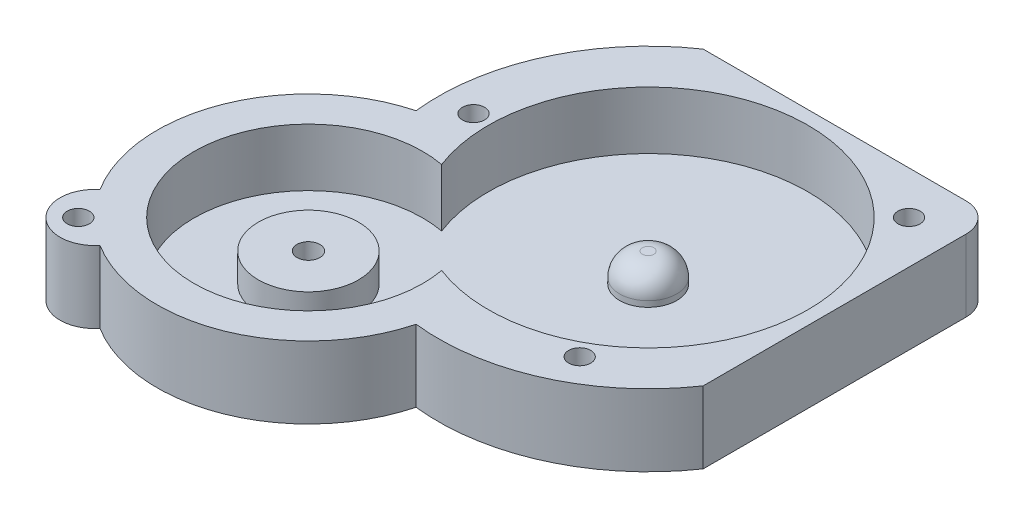
ISO-10303-21;
HEADER;
FILE_DESCRIPTION(('STEP AP214'),'2;1');
FILE_NAME('part.step','',(''),(''),'','','');
FILE_SCHEMA(('AUTOMOTIVE_DESIGN { 1 0 10303 214 1 1 1 1 }'));
ENDSEC;
DATA;
#1=APPLICATION_CONTEXT('core data for automotive mechanical design processes');
#2=APPLICATION_PROTOCOL_DEFINITION('international standard','automotive_design',2000,#1);
#3=PRODUCT_CONTEXT('',#1,'mechanical');
#4=PRODUCT('Part','Part','',(#3));
#5=PRODUCT_RELATED_PRODUCT_CATEGORY('part','',(#4));
#6=PRODUCT_DEFINITION_FORMATION('','',#4);
#7=PRODUCT_DEFINITION_CONTEXT('part definition',#1,'design');
#8=PRODUCT_DEFINITION('design','',#6,#7);
#9=PRODUCT_DEFINITION_SHAPE('','',#8);
#10=(LENGTH_UNIT() NAMED_UNIT(*) SI_UNIT(.MILLI.,.METRE.));
#11=(NAMED_UNIT(*) PLANE_ANGLE_UNIT() SI_UNIT($,.RADIAN.));
#12=(NAMED_UNIT(*) SI_UNIT($,.STERADIAN.) SOLID_ANGLE_UNIT());
#13=UNCERTAINTY_MEASURE_WITH_UNIT(LENGTH_MEASURE(1.E-05),#10,'distance_accuracy_value','');
#14=(GEOMETRIC_REPRESENTATION_CONTEXT(3) GLOBAL_UNCERTAINTY_ASSIGNED_CONTEXT((#13)) GLOBAL_UNIT_ASSIGNED_CONTEXT((#10,
#11,#12)) REPRESENTATION_CONTEXT('',''));
#15=CARTESIAN_POINT('',(0.,0.,0.));
#16=DIRECTION('',(0.,0.,1.));
#17=DIRECTION('',(1.,0.,0.));
#18=AXIS2_PLACEMENT_3D('',#15,#16,#17);
#19=CARTESIAN_POINT('',(-38.4829242915095,0.635000000000004,-28.9438382197023));
#20=DIRECTION('',(0.,-1.,0.));
#21=DIRECTION('',(0.,0.,-1.));
#22=AXIS2_PLACEMENT_3D('',#19,#20,#21);
#23=PLANE('',#22);
#24=CARTESIAN_POINT('',(-101.750340264647,0.635,34.3235777534356));
#25=DIRECTION('',(0.,-1.,0.));
#26=DIRECTION('',(0.,0.,-1.));
#27=AXIS2_PLACEMENT_3D('',#24,#25,#26);
#28=CIRCLE('',#27,2.45745);
#29=CARTESIAN_POINT('',(-101.750340264647,0.635,31.8661277534356));
#30=VERTEX_POINT('',#29);
#31=EDGE_CURVE('E363',#30,#30,#28,.T.);
#32=ORIENTED_EDGE('',*,*,#31,.F.);
#33=EDGE_LOOP('',(#32));
#34=FACE_BOUND('',#33,.T.);
#35=CARTESIAN_POINT('',(-19.302860594839,0.634999999999999,5.43816370851094));
#36=DIRECTION('',(0.,-1.,0.));
#37=DIRECTION('',(0.,0.,-1.));
#38=AXIS2_PLACEMENT_3D('',#35,#36,#37);
#39=CIRCLE('',#38,2.45744999999999);
#40=CARTESIAN_POINT('',(-19.302860594839,0.635,2.98071370851095));
#41=VERTEX_POINT('',#40);
#42=EDGE_CURVE('E168',#41,#41,#39,.T.);
#43=ORIENTED_EDGE('',*,*,#42,.F.);
#44=EDGE_LOOP('',(#43));
#45=FACE_BOUND('',#44,.T.);
#46=CARTESIAN_POINT('',(-38.4829242915095,0.635000000000004,-28.9438382197023));
#47=DIRECTION('',(0.,-1.,0.));
#48=DIRECTION('',(0.,0.,-1.));
#49=AXIS2_PLACEMENT_3D('',#46,#47,#48);
#50=CIRCLE('',#49,46.5899500000001);
#51=CARTESIAN_POINT('',(0.,0.634999999999999,-2.68192703684189));
#52=VERTEX_POINT('',#51);
#53=CARTESIAN_POINT('',(-43.7198958127497,0.635000000000011,17.3508436594101));
#54=VERTEX_POINT('',#53);
#55=EDGE_CURVE('E191',#52,#54,#50,.T.);
#56=ORIENTED_EDGE('',*,*,#55,.T.);
#57=CARTESIAN_POINT('',(-76.2,0.635000000000011,8.77323748878821));
#58=DIRECTION('',(0.,-1.,0.));
#59=DIRECTION('',(0.,0.,-1.));
#60=AXIS2_PLACEMENT_3D('',#57,#58,#59);
#61=CIRCLE('',#60,33.5936377255117);
#62=CARTESIAN_POINT('',(-93.9898070736464,0.635000000000008,37.2698207912715));
#63=VERTEX_POINT('',#62);
#64=EDGE_CURVE('E128',#63,#54,#61,.F.);
#65=ORIENTED_EDGE('',*,*,#64,.F.);
#66=CARTESIAN_POINT('',(-99.9542890404336,0.635,32.5275265292218));
#67=DIRECTION('',(0.,-1.,0.));
#68=DIRECTION('',(0.,0.,-1.));
#69=AXIS2_PLACEMENT_3D('',#66,#67,#68);
#70=CIRCLE('',#69,7.62);
#71=CARTESIAN_POINT('',(-104.696583302483,0.635000000000001,26.5630445624345));
#72=VERTEX_POINT('',#71);
#73=EDGE_CURVE('E132',#72,#63,#70,.F.);
#74=ORIENTED_EDGE('',*,*,#73,.F.);
#75=CARTESIAN_POINT('',(-84.777606170622,0.635000000000006,-23.7068666984621));
#76=VERTEX_POINT('',#75);
#77=EDGE_CURVE('E119',#76,#72,#61,.F.);
#78=ORIENTED_EDGE('',*,*,#77,.F.);
#79=CARTESIAN_POINT('',(-38.4829242915095,0.635000000000004,-28.9438382197023));
#80=DIRECTION('',(0.,-1.,0.));
#81=DIRECTION('',(0.,0.,-1.));
#82=AXIS2_PLACEMENT_3D('',#79,#80,#81);
#83=CIRCLE('',#82,46.58995);
#84=CARTESIAN_POINT('',(-64.74483547437,0.63500000000001,-67.4267625112118));
#85=VERTEX_POINT('',#84);
#86=EDGE_CURVE('E176',#76,#85,#83,.T.);
#87=ORIENTED_EDGE('',*,*,#86,.T.);
#88=DIRECTION('',(1.,0.,0.));
#89=VECTOR('',#88,1.);
#90=CARTESIAN_POINT('',(-64.74483547437,0.63500000000001,-67.4267625112118));
#91=LINE('',#90,#89);
#92=CARTESIAN_POINT('',(-6.35,0.635000000000007,-67.4267625112118));
#93=VERTEX_POINT('',#92);
#94=EDGE_CURVE('E179',#85,#93,#91,.T.);
#95=ORIENTED_EDGE('',*,*,#94,.T.);
#96=CARTESIAN_POINT('',(-6.35,0.635000000000006,-61.0767625112118));
#97=DIRECTION('',(0.,-1.,0.));
#98=DIRECTION('',(0.,0.,-1.));
#99=AXIS2_PLACEMENT_3D('',#96,#97,#98);
#100=CIRCLE('',#99,6.35);
#101=CARTESIAN_POINT('',(0.,0.635000000000005,-61.0767625112118));
#102=VERTEX_POINT('',#101);
#103=EDGE_CURVE('E183',#93,#102,#100,.T.);
#104=ORIENTED_EDGE('',*,*,#103,.T.);
#105=DIRECTION('',(0.,0.,1.));
#106=VECTOR('',#105,1.);
#107=CARTESIAN_POINT('',(0.,0.635000000000006,-61.0767625112118));
#108=LINE('',#107,#106);
#109=EDGE_CURVE('E187',#102,#52,#108,.T.);
#110=ORIENTED_EDGE('',*,*,#109,.T.);
#111=EDGE_LOOP('',(#56,#65,#74,#78,#87,#95,#104,#110));
#112=FACE_BOUND('',#111,.T.);
#113=CARTESIAN_POINT('',(-77.848643242643,0.635000000000006,-29.5244167762885));
#114=DIRECTION('',(0.,-1.,0.));
#115=DIRECTION('',(0.,0.,-1.));
#116=AXIS2_PLACEMENT_3D('',#113,#114,#115);
#117=CIRCLE('',#116,2.45745);
#118=CARTESIAN_POINT('',(-77.848643242643,0.635000000000007,-31.9818667762885));
#119=VERTEX_POINT('',#118);
#120=EDGE_CURVE('E172',#119,#119,#117,.T.);
#121=ORIENTED_EDGE('',*,*,#120,.F.);
#122=EDGE_LOOP('',(#121));
#123=FACE_BOUND('',#122,.T.);
#124=CARTESIAN_POINT('',(-9.52499999999998,0.634999999999997,-57.9017625112118));
#125=DIRECTION('',(0.,1.,0.));
#126=DIRECTION('',(0.,0.,1.));
#127=AXIS2_PLACEMENT_3D('',#124,#125,#126);
#128=CIRCLE('',#127,2.45745);
#129=CARTESIAN_POINT('',(-9.52499999999998,0.634999999999996,-55.4443125112118));
#130=VERTEX_POINT('',#129);
#131=EDGE_CURVE('E353',#130,#130,#128,.T.);
#132=ORIENTED_EDGE('',*,*,#131,.T.);
#133=EDGE_LOOP('',(#132));
#134=FACE_BOUND('',#133,.T.);
#135=ADVANCED_FACE('F43',(#34,#45,#112,#123,#134),#23,.T.);
#136=CARTESIAN_POINT('',(-76.2,-92.8073819297677,8.7732374887882));
#137=DIRECTION('',(0.,1.,0.));
#138=DIRECTION('',(0.,0.,1.));
#139=AXIS2_PLACEMENT_3D('',#136,#137,#138);
#140=CYLINDRICAL_SURFACE('',#139,33.5936377255117);
#141=DIRECTION('',(0.,1.,0.));
#142=VECTOR('',#141,1.);
#143=CARTESIAN_POINT('',(-93.9898070736463,-18.5763586352433,37.2698207912715));
#144=LINE('',#143,#142);
#145=CARTESIAN_POINT('',(-93.9898070736464,16.604,37.2698207912715));
#146=VERTEX_POINT('',#145);
#147=EDGE_CURVE('E137',#63,#146,#144,.T.);
#148=ORIENTED_EDGE('',*,*,#147,.F.);
#149=ORIENTED_EDGE('',*,*,#64,.T.);
#150=DIRECTION('',(0.,1.,0.));
#151=VECTOR('',#150,1.);
#152=CARTESIAN_POINT('',(-43.7198958127497,-92.8073819297677,17.3508436594101));
#153=LINE('',#152,#151);
#154=CARTESIAN_POINT('',(-43.7198958127497,16.604,17.3508436594101));
#155=VERTEX_POINT('',#154);
#156=EDGE_CURVE('E127',#54,#155,#153,.T.);
#157=ORIENTED_EDGE('',*,*,#156,.T.);
#158=CARTESIAN_POINT('',(-76.2,16.604,8.77323748878821));
#159=DIRECTION('',(0.,1.,0.));
#160=DIRECTION('',(0.,0.,1.));
#161=AXIS2_PLACEMENT_3D('',#158,#159,#160);
#162=CIRCLE('',#161,33.5936377255117);
#163=EDGE_CURVE('E59',#146,#155,#162,.T.);
#164=ORIENTED_EDGE('',*,*,#163,.F.);
#165=EDGE_LOOP('',(#148,#149,#157,#164));
#166=FACE_BOUND('',#165,.T.);
#167=ADVANCED_FACE('F278',(#166),#140,.T.);
#168=CARTESIAN_POINT('',(-6.35,3.81000000000001,-61.0767625112118));
#169=DIRECTION('',(0.,1.,0.));
#170=DIRECTION('',(1.,0.,0.));
#171=AXIS2_PLACEMENT_3D('',#168,#169,#170);
#172=CYLINDRICAL_SURFACE('',#171,6.35);
#173=DIRECTION('',(0.,-1.,0.));
#174=VECTOR('',#173,1.);
#175=CARTESIAN_POINT('',(0.,3.81000000000001,-61.0767625112118));
#176=LINE('',#175,#174);
#177=CARTESIAN_POINT('',(0.,16.604,-61.0767625112118));
#178=VERTEX_POINT('',#177);
#179=EDGE_CURVE('E240',#102,#178,#176,.F.);
#180=ORIENTED_EDGE('',*,*,#179,.F.);
#181=ORIENTED_EDGE('',*,*,#103,.F.);
#182=DIRECTION('',(0.,-1.,0.));
#183=VECTOR('',#182,1.);
#184=CARTESIAN_POINT('',(-6.35,0.,-67.4267625112118));
#185=LINE('',#184,#183);
#186=CARTESIAN_POINT('',(-6.35,16.604,-67.4267625112118));
#187=VERTEX_POINT('',#186);
#188=EDGE_CURVE('E249',#187,#93,#185,.T.);
#189=ORIENTED_EDGE('',*,*,#188,.F.);
#190=CARTESIAN_POINT('',(-6.35,16.604,-61.0767625112118));
#191=DIRECTION('',(0.,1.,0.));
#192=DIRECTION('',(1.,0.,0.));
#193=AXIS2_PLACEMENT_3D('',#190,#191,#192);
#194=CIRCLE('',#193,6.35);
#195=EDGE_CURVE('E201',#178,#187,#194,.T.);
#196=ORIENTED_EDGE('',*,*,#195,.F.);
#197=EDGE_LOOP('',(#180,#181,#189,#196));
#198=FACE_BOUND('',#197,.T.);
#199=ADVANCED_FACE('F288',(#198),#172,.T.);
#200=CARTESIAN_POINT('',(0.,3.81000000000001,-67.4267625112118));
#201=DIRECTION('',(-1.,0.,0.));
#202=DIRECTION('',(0.,1.,0.));
#203=AXIS2_PLACEMENT_3D('',#200,#201,#202);
#204=PLANE('',#203);
#205=DIRECTION('',(0.,-1.,0.));
#206=VECTOR('',#205,1.);
#207=CARTESIAN_POINT('',(0.,16.604,-2.68192703684186));
#208=LINE('',#207,#206);
#209=CARTESIAN_POINT('',(0.,16.604,-2.68192703684186));
#210=VERTEX_POINT('',#209);
#211=EDGE_CURVE('E246',#210,#52,#208,.T.);
#212=ORIENTED_EDGE('',*,*,#211,.T.);
#213=ORIENTED_EDGE('',*,*,#109,.F.);
#214=ORIENTED_EDGE('',*,*,#179,.T.);
#215=DIRECTION('',(0.,0.,-1.));
#216=VECTOR('',#215,1.);
#217=CARTESIAN_POINT('',(0.,16.604,84.9732374887882));
#218=LINE('',#217,#216);
#219=EDGE_CURVE('E197',#210,#178,#218,.T.);
#220=ORIENTED_EDGE('',*,*,#219,.F.);
#221=EDGE_LOOP('',(#212,#213,#214,#220));
#222=FACE_BOUND('',#221,.T.);
#223=ADVANCED_FACE('F323',(#222),#204,.F.);
#224=CARTESIAN_POINT('',(-38.4829242915095,16.604,-28.9438382197023));
#225=DIRECTION('',(0.,-1.,0.));
#226=DIRECTION('',(-1.,0.,0.));
#227=AXIS2_PLACEMENT_3D('',#224,#225,#226);
#228=CYLINDRICAL_SURFACE('',#227,46.58995);
#229=CARTESIAN_POINT('',(-38.4829242915095,16.604,-28.9438382197023));
#230=DIRECTION('',(0.,1.,0.));
#231=DIRECTION('',(1.,0.,0.));
#232=AXIS2_PLACEMENT_3D('',#229,#230,#231);
#233=CIRCLE('',#232,46.58995);
#234=EDGE_CURVE('E194',#155,#210,#233,.T.);
#235=ORIENTED_EDGE('',*,*,#234,.F.);
#236=ORIENTED_EDGE('',*,*,#156,.F.);
#237=ORIENTED_EDGE('',*,*,#55,.F.);
#238=ORIENTED_EDGE('',*,*,#211,.F.);
#239=EDGE_LOOP('',(#235,#236,#237,#238));
#240=FACE_BOUND('',#239,.T.);
#241=ADVANCED_FACE('F320',(#240),#228,.T.);
#242=CARTESIAN_POINT('',(0.,3.81000000000001,-67.4267625112118));
#243=DIRECTION('',(0.,0.,-1.));
#244=DIRECTION('',(-1.,0.,0.));
#245=AXIS2_PLACEMENT_3D('',#242,#243,#244);
#246=PLANE('',#245);
#247=ORIENTED_EDGE('',*,*,#188,.T.);
#248=ORIENTED_EDGE('',*,*,#94,.F.);
#249=DIRECTION('',(0.,-1.,0.));
#250=VECTOR('',#249,1.);
#251=CARTESIAN_POINT('',(-64.74483547437,16.604,-67.4267625112118));
#252=LINE('',#251,#250);
#253=CARTESIAN_POINT('',(-64.74483547437,16.604,-67.4267625112118));
#254=VERTEX_POINT('',#253);
#255=EDGE_CURVE('E228',#254,#85,#252,.T.);
#256=ORIENTED_EDGE('',*,*,#255,.F.);
#257=DIRECTION('',(-1.,0.,0.));
#258=VECTOR('',#257,1.);
#259=CARTESIAN_POINT('',(0.,16.604,-67.4267625112118));
#260=LINE('',#259,#258);
#261=EDGE_CURVE('E205',#187,#254,#260,.T.);
#262=ORIENTED_EDGE('',*,*,#261,.F.);
#263=EDGE_LOOP('',(#247,#248,#256,#262));
#264=FACE_BOUND('',#263,.T.);
#265=ADVANCED_FACE('F306',(#264),#246,.T.);
#266=CARTESIAN_POINT('',(0.,16.604,84.9732374887882));
#267=DIRECTION('',(0.,1.,0.));
#268=DIRECTION('',(1.,0.,0.));
#269=AXIS2_PLACEMENT_3D('',#266,#267,#268);
#270=PLANE('',#269);
#271=CARTESIAN_POINT('',(-101.750340264647,16.604,34.3235777534356));
#272=DIRECTION('',(0.,1.,0.));
#273=DIRECTION('',(0.,0.,1.));
#274=AXIS2_PLACEMENT_3D('',#271,#272,#273);
#275=CIRCLE('',#274,2.45745);
#276=CARTESIAN_POINT('',(-101.750340264647,16.604,36.7810277534356));
#277=VERTEX_POINT('',#276);
#278=EDGE_CURVE('E367',#277,#277,#275,.T.);
#279=ORIENTED_EDGE('',*,*,#278,.F.);
#280=EDGE_LOOP('',(#279));
#281=FACE_BOUND('',#280,.T.);
#282=CARTESIAN_POINT('',(-9.52499999999998,16.604,-57.9017625112118));
#283=DIRECTION('',(0.,1.,0.));
#284=DIRECTION('',(0.,0.,1.));
#285=AXIS2_PLACEMENT_3D('',#282,#283,#284);
#286=CIRCLE('',#285,2.45745);
#287=CARTESIAN_POINT('',(-9.52499999999998,16.604,-55.4443125112118));
#288=VERTEX_POINT('',#287);
#289=EDGE_CURVE('E357',#288,#288,#286,.T.);
#290=ORIENTED_EDGE('',*,*,#289,.F.);
#291=EDGE_LOOP('',(#290));
#292=FACE_BOUND('',#291,.T.);
#293=CARTESIAN_POINT('',(-84.777606170622,16.604,-23.7068666984621));
#294=VERTEX_POINT('',#293);
#295=CARTESIAN_POINT('',(-104.696583302483,16.604,26.5630445624345));
#296=VERTEX_POINT('',#295);
#297=EDGE_CURVE('E147',#294,#296,#162,.T.);
#298=ORIENTED_EDGE('',*,*,#297,.T.);
#299=CARTESIAN_POINT('',(-99.9542890404336,16.604,32.5275265292218));
#300=DIRECTION('',(0.,1.,0.));
#301=DIRECTION('',(0.,0.,1.));
#302=AXIS2_PLACEMENT_3D('',#299,#300,#301);
#303=CIRCLE('',#302,7.62);
#304=EDGE_CURVE('E138',#296,#146,#303,.T.);
#305=ORIENTED_EDGE('',*,*,#304,.T.);
#306=ORIENTED_EDGE('',*,*,#163,.T.);
#307=ORIENTED_EDGE('',*,*,#234,.T.);
#308=ORIENTED_EDGE('',*,*,#219,.T.);
#309=ORIENTED_EDGE('',*,*,#195,.T.);
#310=ORIENTED_EDGE('',*,*,#261,.T.);
#311=CARTESIAN_POINT('',(-38.4829242915095,16.604,-28.9438382197023));
#312=DIRECTION('',(0.,1.,0.));
#313=DIRECTION('',(1.,0.,0.));
#314=AXIS2_PLACEMENT_3D('',#311,#312,#313);
#315=CIRCLE('',#314,46.58995);
#316=EDGE_CURVE('E208',#254,#294,#315,.T.);
#317=ORIENTED_EDGE('',*,*,#316,.T.);
#318=EDGE_LOOP('',(#298,#305,#306,#307,#308,#309,#310,#317));
#319=FACE_BOUND('',#318,.T.);
#320=CARTESIAN_POINT('',(-19.302860594839,16.604,5.43816370851094));
#321=DIRECTION('',(0.,1.,0.));
#322=DIRECTION('',(1.,0.,0.));
#323=AXIS2_PLACEMENT_3D('',#320,#321,#322);
#324=CIRCLE('',#323,2.45744999999999);
#325=CARTESIAN_POINT('',(-16.845410594839,16.604,5.43816370851094));
#326=VERTEX_POINT('',#325);
#327=EDGE_CURVE('E212',#326,#326,#324,.F.);
#328=ORIENTED_EDGE('',*,*,#327,.T.);
#329=EDGE_LOOP('',(#328));
#330=FACE_BOUND('',#329,.T.);
#331=CARTESIAN_POINT('',(-77.848643242643,16.604,-29.5244167762885));
#332=DIRECTION('',(0.,1.,0.));
#333=DIRECTION('',(1.,0.,0.));
#334=AXIS2_PLACEMENT_3D('',#331,#332,#333);
#335=CIRCLE('',#334,2.45744999999999);
#336=CARTESIAN_POINT('',(-75.3911932426431,16.604,-29.5244167762885));
#337=VERTEX_POINT('',#336);
#338=EDGE_CURVE('E216',#337,#337,#335,.F.);
#339=ORIENTED_EDGE('',*,*,#338,.T.);
#340=EDGE_LOOP('',(#339));
#341=FACE_BOUND('',#340,.T.);
#342=CARTESIAN_POINT('',(-38.4829242915095,16.604,-28.9438382197023));
#343=DIRECTION('',(0.,1.,0.));
#344=DIRECTION('',(1.,0.,0.));
#345=AXIS2_PLACEMENT_3D('',#342,#343,#344);
#346=CIRCLE('',#345,35.47745);
#347=CARTESIAN_POINT('',(-51.220979809447,16.604,4.16796330368881));
#348=VERTEX_POINT('',#347);
#349=CARTESIAN_POINT('',(-71.5947258149006,16.604,-16.2057827017649));
#350=VERTEX_POINT('',#349);
#351=EDGE_CURVE('E220',#348,#350,#346,.T.);
#352=ORIENTED_EDGE('',*,*,#351,.F.);
#353=CARTESIAN_POINT('',(-76.2,16.604,8.77323748878821));
#354=DIRECTION('',(0.,1.,0.));
#355=DIRECTION('',(1.,0.,0.));
#356=AXIS2_PLACEMENT_3D('',#353,#354,#355);
#357=CIRCLE('',#356,25.4);
#358=EDGE_CURVE('E224',#350,#348,#357,.T.);
#359=ORIENTED_EDGE('',*,*,#358,.F.);
#360=EDGE_LOOP('',(#352,#359));
#361=FACE_BOUND('',#360,.T.);
#362=ADVANCED_FACE('F302',(#281,#292,#319,#330,#341,#361),#270,.T.);
#363=CARTESIAN_POINT('',(-77.848643242643,3.81000000000001,-29.5244167762885));
#364=DIRECTION('',(0.,1.,0.));
#365=DIRECTION('',(1.,0.,0.));
#366=AXIS2_PLACEMENT_3D('',#363,#364,#365);
#367=CYLINDRICAL_SURFACE('',#366,2.45744999999999);
#368=ORIENTED_EDGE('',*,*,#338,.F.);
#369=EDGE_LOOP('',(#368));
#370=FACE_BOUND('',#369,.T.);
#371=ORIENTED_EDGE('',*,*,#120,.T.);
#372=EDGE_LOOP('',(#371));
#373=FACE_BOUND('',#372,.T.);
#374=ADVANCED_FACE('F305',(#370,#373),#367,.F.);
#375=CARTESIAN_POINT('',(-19.302860594839,3.81,5.43816370851094));
#376=DIRECTION('',(0.,1.,0.));
#377=DIRECTION('',(1.,0.,0.));
#378=AXIS2_PLACEMENT_3D('',#375,#376,#377);
#379=CYLINDRICAL_SURFACE('',#378,2.45744999999999);
#380=ORIENTED_EDGE('',*,*,#327,.F.);
#381=EDGE_LOOP('',(#380));
#382=FACE_BOUND('',#381,.T.);
#383=ORIENTED_EDGE('',*,*,#42,.T.);
#384=EDGE_LOOP('',(#383));
#385=FACE_BOUND('',#384,.T.);
#386=ADVANCED_FACE('F318',(#382,#385),#379,.F.);
#387=CARTESIAN_POINT('',(-38.4829242915095,16.604,-28.9438382197023));
#388=DIRECTION('',(0.,-1.,0.));
#389=DIRECTION('',(-1.,0.,0.));
#390=AXIS2_PLACEMENT_3D('',#387,#388,#389);
#391=CYLINDRICAL_SURFACE('',#390,46.58995);
#392=ORIENTED_EDGE('',*,*,#86,.F.);
#393=DIRECTION('',(0.,1.,0.));
#394=VECTOR('',#393,1.);
#395=CARTESIAN_POINT('',(-84.777606170622,-92.8073819297677,-23.7068666984621));
#396=LINE('',#395,#394);
#397=EDGE_CURVE('E123',#76,#294,#396,.T.);
#398=ORIENTED_EDGE('',*,*,#397,.T.);
#399=ORIENTED_EDGE('',*,*,#316,.F.);
#400=ORIENTED_EDGE('',*,*,#255,.T.);
#401=EDGE_LOOP('',(#392,#398,#399,#400));
#402=FACE_BOUND('',#401,.T.);
#403=ADVANCED_FACE('F314',(#402),#391,.T.);
#404=CARTESIAN_POINT('',(-38.4829242915095,16.604,-28.9438382197023));
#405=DIRECTION('',(0.,-1.,0.));
#406=DIRECTION('',(-1.,0.,0.));
#407=AXIS2_PLACEMENT_3D('',#404,#405,#406);
#408=CYLINDRICAL_SURFACE('',#407,35.47745);
#409=CARTESIAN_POINT('',(-38.4829242915095,3.81,-28.9438382197023));
#410=DIRECTION('',(0.,1.,0.));
#411=DIRECTION('',(1.,0.,0.));
#412=AXIS2_PLACEMENT_3D('',#409,#410,#411);
#413=CIRCLE('',#412,35.47745);
#414=CARTESIAN_POINT('',(-51.220979809447,3.81,4.16796330368881));
#415=VERTEX_POINT('',#414);
#416=CARTESIAN_POINT('',(-71.5947258149006,3.81,-16.2057827017649));
#417=VERTEX_POINT('',#416);
#418=EDGE_CURVE('E231',#415,#417,#413,.T.);
#419=ORIENTED_EDGE('',*,*,#418,.F.);
#420=DIRECTION('',(0.,-1.,0.));
#421=VECTOR('',#420,1.);
#422=CARTESIAN_POINT('',(-51.220979809447,16.604,4.16796330368881));
#423=LINE('',#422,#421);
#424=EDGE_CURVE('E245',#348,#415,#423,.T.);
#425=ORIENTED_EDGE('',*,*,#424,.F.);
#426=ORIENTED_EDGE('',*,*,#351,.T.);
#427=DIRECTION('',(0.,-1.,0.));
#428=VECTOR('',#427,1.);
#429=CARTESIAN_POINT('',(-71.5947258149006,16.604,-16.2057827017649));
#430=LINE('',#429,#428);
#431=EDGE_CURVE('E241',#350,#417,#430,.T.);
#432=ORIENTED_EDGE('',*,*,#431,.T.);
#433=EDGE_LOOP('',(#419,#425,#426,#432));
#434=FACE_BOUND('',#433,.T.);
#435=ADVANCED_FACE('F310',(#434),#408,.F.);
#436=CARTESIAN_POINT('',(-76.2,16.604,8.77323748878821));
#437=DIRECTION('',(0.,-1.,0.));
#438=DIRECTION('',(-1.,0.,0.));
#439=AXIS2_PLACEMENT_3D('',#436,#437,#438);
#440=CYLINDRICAL_SURFACE('',#439,25.4);
#441=CARTESIAN_POINT('',(-76.2,3.81,8.77323748878821));
#442=DIRECTION('',(0.,1.,0.));
#443=DIRECTION('',(1.,0.,0.));
#444=AXIS2_PLACEMENT_3D('',#441,#442,#443);
#445=CIRCLE('',#444,25.4);
#446=EDGE_CURVE('E236',#417,#415,#445,.T.);
#447=ORIENTED_EDGE('',*,*,#446,.F.);
#448=ORIENTED_EDGE('',*,*,#431,.F.);
#449=ORIENTED_EDGE('',*,*,#358,.T.);
#450=ORIENTED_EDGE('',*,*,#424,.T.);
#451=EDGE_LOOP('',(#447,#448,#449,#450));
#452=FACE_BOUND('',#451,.T.);
#453=ADVANCED_FACE('F299',(#452),#440,.F.);
#454=CARTESIAN_POINT('',(-38.4829242915095,3.81,-28.9438382197023));
#455=DIRECTION('',(0.,-1.,0.));
#456=DIRECTION('',(0.,0.,-1.));
#457=AXIS2_PLACEMENT_3D('',#454,#455,#456);
#458=PLANE('',#457);
#459=CARTESIAN_POINT('',(-38.4829242915095,3.81,-28.9438382197023));
#460=DIRECTION('',(0.,-1.,0.));
#461=DIRECTION('',(0.,0.,-1.));
#462=AXIS2_PLACEMENT_3D('',#459,#460,#461);
#463=CIRCLE('',#462,6.35);
#464=CARTESIAN_POINT('',(-38.4829242915095,3.81000000000001,-35.2938382197023));
#465=VERTEX_POINT('',#464);
#466=EDGE_CURVE('E262',#465,#465,#463,.F.);
#467=ORIENTED_EDGE('',*,*,#466,.F.);
#468=EDGE_LOOP('',(#467));
#469=FACE_BOUND('',#468,.T.);
#470=CARTESIAN_POINT('',(-76.2,3.81,8.77323748878821));
#471=DIRECTION('',(0.,-1.,0.));
#472=DIRECTION('',(0.,0.,-1.));
#473=AXIS2_PLACEMENT_3D('',#470,#471,#472);
#474=CIRCLE('',#473,11.1125);
#475=CARTESIAN_POINT('',(-76.2,3.81,-2.33926251121179));
#476=VERTEX_POINT('',#475);
#477=EDGE_CURVE('E235',#476,#476,#474,.F.);
#478=ORIENTED_EDGE('',*,*,#477,.F.);
#479=EDGE_LOOP('',(#478));
#480=FACE_BOUND('',#479,.T.);
#481=ORIENTED_EDGE('',*,*,#446,.T.);
#482=ORIENTED_EDGE('',*,*,#418,.T.);
#483=EDGE_LOOP('',(#481,#482));
#484=FACE_BOUND('',#483,.T.);
#485=ADVANCED_FACE('F295',(#469,#480,#484),#458,.F.);
#486=CARTESIAN_POINT('',(-76.2,10.16,8.77323748878821));
#487=DIRECTION('',(0.,1.,0.));
#488=DIRECTION('',(0.,0.,1.));
#489=AXIS2_PLACEMENT_3D('',#486,#487,#488);
#490=PLANE('',#489);
#491=CARTESIAN_POINT('',(-76.2,10.16,8.77323748878821));
#492=DIRECTION('',(0.,1.,0.));
#493=DIRECTION('',(0.,0.,1.));
#494=AXIS2_PLACEMENT_3D('',#491,#492,#493);
#495=CIRCLE('',#494,11.1125);
#496=CARTESIAN_POINT('',(-76.2,10.16,19.8857374887882));
#497=VERTEX_POINT('',#496);
#498=EDGE_CURVE('E161',#497,#497,#495,.T.);
#499=ORIENTED_EDGE('',*,*,#498,.T.);
#500=EDGE_LOOP('',(#499));
#501=FACE_BOUND('',#500,.T.);
#502=CARTESIAN_POINT('',(-76.2,10.16,8.77323748878821));
#503=DIRECTION('',(0.,1.,0.));
#504=DIRECTION('',(0.,0.,1.));
#505=AXIS2_PLACEMENT_3D('',#502,#503,#504);
#506=CIRCLE('',#505,2.54);
#507=CARTESIAN_POINT('',(-76.2,10.16,11.3132374887882));
#508=VERTEX_POINT('',#507);
#509=EDGE_CURVE('E157',#508,#508,#506,.T.);
#510=ORIENTED_EDGE('',*,*,#509,.F.);
#511=EDGE_LOOP('',(#510));
#512=FACE_BOUND('',#511,.T.);
#513=ADVANCED_FACE('F298',(#501,#512),#490,.T.);
#514=CARTESIAN_POINT('',(-76.2,10.16,8.77323748878821));
#515=DIRECTION('',(0.,-1.,0.));
#516=DIRECTION('',(0.,0.,-1.));
#517=AXIS2_PLACEMENT_3D('',#514,#515,#516);
#518=CYLINDRICAL_SURFACE('',#517,11.1125);
#519=ORIENTED_EDGE('',*,*,#498,.F.);
#520=EDGE_LOOP('',(#519));
#521=FACE_BOUND('',#520,.T.);
#522=ORIENTED_EDGE('',*,*,#477,.T.);
#523=EDGE_LOOP('',(#522));
#524=FACE_BOUND('',#523,.T.);
#525=ADVANCED_FACE('F293',(#521,#524),#518,.T.);
#526=CARTESIAN_POINT('',(-76.2,10.16,8.77323748878821));
#527=DIRECTION('',(0.,-1.,0.));
#528=DIRECTION('',(0.,0.,-1.));
#529=AXIS2_PLACEMENT_3D('',#526,#527,#528);
#530=CYLINDRICAL_SURFACE('',#529,2.54);
#531=ORIENTED_EDGE('',*,*,#509,.T.);
#532=EDGE_LOOP('',(#531));
#533=FACE_BOUND('',#532,.T.);
#534=CARTESIAN_POINT('',(-76.2,3.81,8.77323748878821));
#535=DIRECTION('',(0.,1.,0.));
#536=DIRECTION('',(0.,0.,1.));
#537=AXIS2_PLACEMENT_3D('',#534,#535,#536);
#538=CIRCLE('',#537,2.54);
#539=CARTESIAN_POINT('',(-76.2,3.81,11.3132374887882));
#540=VERTEX_POINT('',#539);
#541=EDGE_CURVE('E156',#540,#540,#538,.T.);
#542=ORIENTED_EDGE('',*,*,#541,.F.);
#543=EDGE_LOOP('',(#542));
#544=FACE_BOUND('',#543,.T.);
#545=ADVANCED_FACE('F392',(#533,#544),#530,.F.);
#546=ORIENTED_EDGE('',*,*,#541,.T.);
#547=EDGE_LOOP('',(#546));
#548=FACE_BOUND('',#547,.T.);
#549=ADVANCED_FACE('F301',(#548),#458,.F.);
#550=CARTESIAN_POINT('',(-38.4829242915095,10.16,-28.9438382197023));
#551=DIRECTION('',(0.,-1.,0.));
#552=DIRECTION('',(0.,0.,-1.));
#553=AXIS2_PLACEMENT_3D('',#550,#551,#552);
#554=CYLINDRICAL_SURFACE('',#553,6.35);
#555=CARTESIAN_POINT('',(-38.4829242915095,5.08,-28.9438382197023));
#556=DIRECTION('',(0.,1.,0.));
#557=DIRECTION('',(0.,0.,1.));
#558=AXIS2_PLACEMENT_3D('',#555,#556,#557);
#559=CIRCLE('',#558,6.35);
#560=CARTESIAN_POINT('',(-38.4829242915095,5.08,-22.5938382197023));
#561=VERTEX_POINT('',#560);
#562=EDGE_CURVE('E11',#561,#561,#559,.F.);
#563=ORIENTED_EDGE('',*,*,#562,.T.);
#564=EDGE_LOOP('',(#563));
#565=FACE_BOUND('',#564,.T.);
#566=ORIENTED_EDGE('',*,*,#466,.T.);
#567=EDGE_LOOP('',(#566));
#568=FACE_BOUND('',#567,.T.);
#569=ADVANCED_FACE('F279',(#565,#568),#554,.T.);
#570=CARTESIAN_POINT('',(-38.4829242915095,10.16,-28.9438382197023));
#571=DIRECTION('',(0.,1.,0.));
#572=DIRECTION('',(0.,0.,1.));
#573=AXIS2_PLACEMENT_3D('',#570,#571,#572);
#574=PLANE('',#573);
#575=CARTESIAN_POINT('',(-38.4829242915095,10.16,-28.9438382197023));
#576=DIRECTION('',(0.,1.,0.));
#577=DIRECTION('',(0.,0.,1.));
#578=AXIS2_PLACEMENT_3D('',#575,#576,#577);
#579=CIRCLE('',#578,1.27);
#580=CARTESIAN_POINT('',(-38.4829242915095,10.16,-27.6738382197023));
#581=VERTEX_POINT('',#580);
#582=EDGE_CURVE('E52',#581,#581,#579,.T.);
#583=ORIENTED_EDGE('',*,*,#582,.T.);
#584=EDGE_LOOP('',(#583));
#585=FACE_BOUND('',#584,.T.);
#586=ADVANCED_FACE('F269',(#585),#574,.T.);
#587=CARTESIAN_POINT('',(-38.4829242915095,5.08,-28.9438382197023));
#588=DIRECTION('',(0.,1.,0.));
#589=DIRECTION('',(0.,0.,1.));
#590=AXIS2_PLACEMENT_3D('',#587,#588,#589);
#591=DEGENERATE_TOROIDAL_SURFACE('',#590,1.27,5.08,.T.);
#592=ORIENTED_EDGE('',*,*,#562,.F.);
#593=EDGE_LOOP('',(#592));
#594=FACE_BOUND('',#593,.T.);
#595=ORIENTED_EDGE('',*,*,#582,.F.);
#596=EDGE_LOOP('',(#595));
#597=FACE_BOUND('',#596,.T.);
#598=ADVANCED_FACE('F45',(#594,#597),#591,.T.);
#599=DIRECTION('',(0.,1.,0.));
#600=VECTOR('',#599,1.);
#601=CARTESIAN_POINT('',(-104.696583302483,-18.5763586352433,26.5630445624345));
#602=LINE('',#601,#600);
#603=EDGE_CURVE('E67',#72,#296,#602,.T.);
#604=ORIENTED_EDGE('',*,*,#603,.T.);
#605=ORIENTED_EDGE('',*,*,#297,.F.);
#606=ORIENTED_EDGE('',*,*,#397,.F.);
#607=ORIENTED_EDGE('',*,*,#77,.T.);
#608=EDGE_LOOP('',(#604,#605,#606,#607));
#609=FACE_BOUND('',#608,.T.);
#610=ADVANCED_FACE('F121',(#609),#140,.T.);
#611=CARTESIAN_POINT('',(-99.9542890404336,-18.5763586352433,32.5275265292218));
#612=DIRECTION('',(0.,1.,0.));
#613=DIRECTION('',(0.,0.,1.));
#614=AXIS2_PLACEMENT_3D('',#611,#612,#613);
#615=CYLINDRICAL_SURFACE('',#614,7.62);
#616=ORIENTED_EDGE('',*,*,#603,.F.);
#617=ORIENTED_EDGE('',*,*,#73,.T.);
#618=ORIENTED_EDGE('',*,*,#147,.T.);
#619=ORIENTED_EDGE('',*,*,#304,.F.);
#620=EDGE_LOOP('',(#616,#617,#618,#619));
#621=FACE_BOUND('',#620,.T.);
#622=ADVANCED_FACE('F141',(#621),#615,.T.);
#623=CARTESIAN_POINT('',(-9.52499999999998,16.604,-57.9017625112118));
#624=DIRECTION('',(0.,1.,0.));
#625=DIRECTION('',(0.,0.,1.));
#626=AXIS2_PLACEMENT_3D('',#623,#624,#625);
#627=CYLINDRICAL_SURFACE('',#626,2.45745);
#628=ORIENTED_EDGE('',*,*,#131,.F.);
#629=EDGE_LOOP('',(#628));
#630=FACE_BOUND('',#629,.T.);
#631=ORIENTED_EDGE('',*,*,#289,.T.);
#632=EDGE_LOOP('',(#631));
#633=FACE_BOUND('',#632,.T.);
#634=ADVANCED_FACE('F377',(#630,#633),#627,.F.);
#635=CARTESIAN_POINT('',(-101.750340264647,16.604,34.3235777534356));
#636=DIRECTION('',(0.,1.,0.));
#637=DIRECTION('',(0.,0.,1.));
#638=AXIS2_PLACEMENT_3D('',#635,#636,#637);
#639=CYLINDRICAL_SURFACE('',#638,2.45745);
#640=ORIENTED_EDGE('',*,*,#278,.T.);
#641=EDGE_LOOP('',(#640));
#642=FACE_BOUND('',#641,.T.);
#643=ORIENTED_EDGE('',*,*,#31,.T.);
#644=EDGE_LOOP('',(#643));
#645=FACE_BOUND('',#644,.T.);
#646=ADVANCED_FACE('F372',(#642,#645),#639,.F.);
#647=CLOSED_SHELL('',(#135,#167,#199,#223,#241,#265,#362,#374,#386,#403,#435,#453,#485,#513,
#525,#545,#549,#569,#586,#598,#610,#622,#634,#646));
#648=MANIFOLD_SOLID_BREP('B2',#647);
#649=ADVANCED_BREP_SHAPE_REPRESENTATION('',(#18,#648),#14);
#650=SHAPE_DEFINITION_REPRESENTATION(#9,#649);
ENDSEC;
END-ISO-10303-21;
